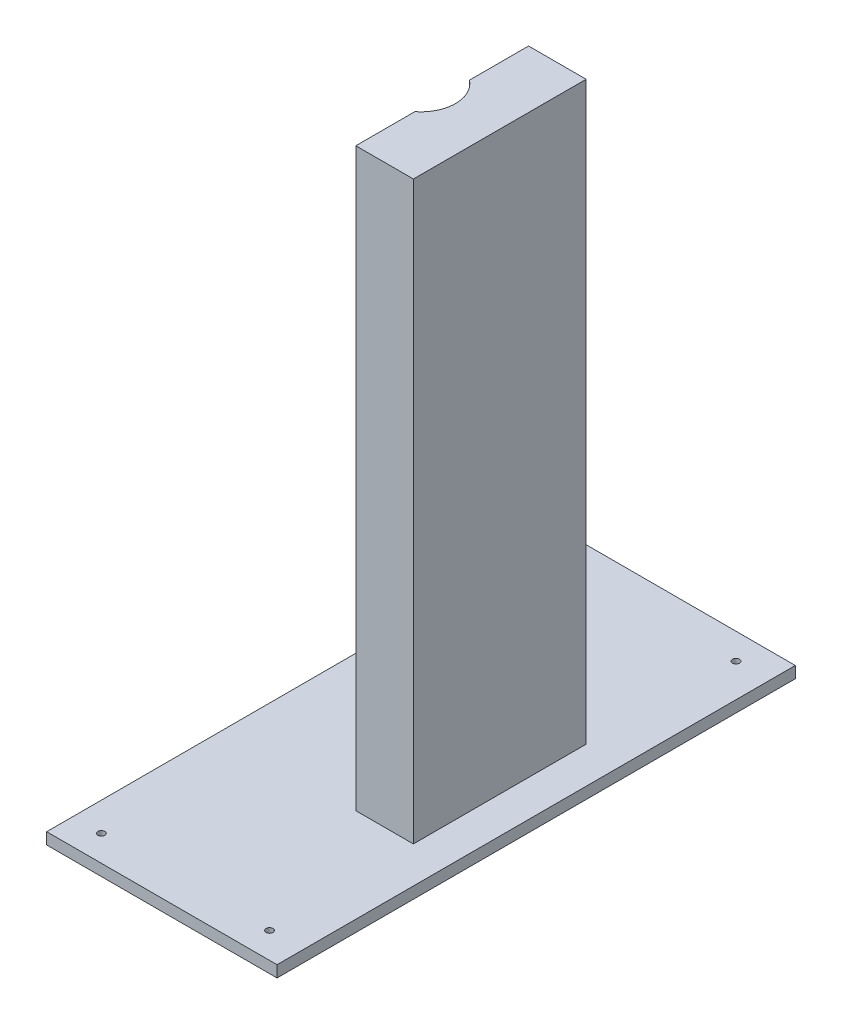
ISO-10303-21;
HEADER;
FILE_DESCRIPTION(('STEP AP214'),'2;1');
FILE_NAME('part.step','',(''),(''),'','','');
FILE_SCHEMA(('AUTOMOTIVE_DESIGN { 1 0 10303 214 1 1 1 1 }'));
ENDSEC;
DATA;
#1=APPLICATION_CONTEXT('core data for automotive mechanical design processes');
#2=APPLICATION_PROTOCOL_DEFINITION('international standard','automotive_design',2000,#1);
#3=PRODUCT_CONTEXT('',#1,'mechanical');
#4=PRODUCT('Part','Part','',(#3));
#5=PRODUCT_RELATED_PRODUCT_CATEGORY('part','',(#4));
#6=PRODUCT_DEFINITION_FORMATION('','',#4);
#7=PRODUCT_DEFINITION_CONTEXT('part definition',#1,'design');
#8=PRODUCT_DEFINITION('design','',#6,#7);
#9=PRODUCT_DEFINITION_SHAPE('','',#8);
#10=(LENGTH_UNIT() NAMED_UNIT(*) SI_UNIT(.MILLI.,.METRE.));
#11=(NAMED_UNIT(*) PLANE_ANGLE_UNIT() SI_UNIT($,.RADIAN.));
#12=(NAMED_UNIT(*) SI_UNIT($,.STERADIAN.) SOLID_ANGLE_UNIT());
#13=UNCERTAINTY_MEASURE_WITH_UNIT(LENGTH_MEASURE(1.E-05),#10,'distance_accuracy_value','');
#14=(GEOMETRIC_REPRESENTATION_CONTEXT(3) GLOBAL_UNCERTAINTY_ASSIGNED_CONTEXT((#13)) GLOBAL_UNIT_ASSIGNED_CONTEXT((#10,
#11,#12)) REPRESENTATION_CONTEXT('',''));
#15=CARTESIAN_POINT('',(0.,0.,0.));
#16=DIRECTION('',(0.,0.,1.));
#17=DIRECTION('',(1.,0.,0.));
#18=AXIS2_PLACEMENT_3D('',#15,#16,#17);
#19=CARTESIAN_POINT('',(0.,10.,0.));
#20=DIRECTION('',(0.,1.,0.));
#21=DIRECTION('',(0.,0.,1.));
#22=AXIS2_PLACEMENT_3D('',#19,#20,#21);
#23=PLANE('',#22);
#24=DIRECTION('',(0.,0.,-1.));
#25=VECTOR('',#24,1.);
#26=CARTESIAN_POINT('',(18.394275910826,10.,-1.21911485731604E-13));
#27=LINE('',#26,#25);
#28=CARTESIAN_POINT('',(18.3942759108265,10.,74.9999999999998));
#29=VERTEX_POINT('',#28);
#30=CARTESIAN_POINT('',(18.3942759108262,10.,23.6991690511798));
#31=VERTEX_POINT('',#30);
#32=EDGE_CURVE('E176',#29,#31,#27,.T.);
#33=ORIENTED_EDGE('',*,*,#32,.T.);
#34=CARTESIAN_POINT('',(0.,10.,0.));
#35=DIRECTION('',(0.,1.,0.));
#36=DIRECTION('',(0.,0.,1.));
#37=AXIS2_PLACEMENT_3D('',#34,#35,#36);
#38=CIRCLE('',#37,30.);
#39=CARTESIAN_POINT('',(18.3942759108259,10.,-23.6991690511801));
#40=VERTEX_POINT('',#39);
#41=EDGE_CURVE('E143',#40,#31,#38,.T.);
#42=ORIENTED_EDGE('',*,*,#41,.F.);
#43=DIRECTION('',(0.,0.,-1.));
#44=VECTOR('',#43,1.);
#45=CARTESIAN_POINT('',(18.394275910826,10.,-1.23155480483967E-13));
#46=LINE('',#45,#44);
#47=CARTESIAN_POINT('',(18.3942759108255,10.,-75.0000000000001));
#48=VERTEX_POINT('',#47);
#49=EDGE_CURVE('E155',#40,#48,#46,.T.);
#50=ORIENTED_EDGE('',*,*,#49,.T.);
#51=DIRECTION('',(-1.,0.,0.));
#52=VECTOR('',#51,1.);
#53=CARTESIAN_POINT('',(-4.99600361081321E-13,10.,-75.));
#54=LINE('',#53,#52);
#55=CARTESIAN_POINT('',(68.3942759108255,10.,-75.0000000000005));
#56=VERTEX_POINT('',#55);
#57=EDGE_CURVE('E188',#56,#48,#54,.T.);
#58=ORIENTED_EDGE('',*,*,#57,.F.);
#59=DIRECTION('',(0.,0.,1.));
#60=VECTOR('',#59,1.);
#61=CARTESIAN_POINT('',(68.394275910826,10.,-4.61925140868319E-13));
#62=LINE('',#61,#60);
#63=CARTESIAN_POINT('',(68.3942759108266,10.,74.9999999999995));
#64=VERTEX_POINT('',#63);
#65=EDGE_CURVE('E184',#56,#64,#62,.T.);
#66=ORIENTED_EDGE('',*,*,#65,.T.);
#67=DIRECTION('',(-1.,0.,0.));
#68=VECTOR('',#67,1.);
#69=CARTESIAN_POINT('',(4.57966997657877E-13,10.,75.));
#70=LINE('',#69,#68);
#71=EDGE_CURVE('E180',#64,#29,#70,.T.);
#72=ORIENTED_EDGE('',*,*,#71,.T.);
#73=EDGE_LOOP('',(#33,#42,#50,#58,#66,#72));
#74=FACE_BOUND('',#73,.T.);
#75=CARTESIAN_POINT('',(71.,10.,202.5));
#76=DIRECTION('',(0.,1.,0.));
#77=DIRECTION('',(0.,0.,-1.));
#78=AXIS2_PLACEMENT_3D('',#75,#76,#77);
#79=CIRCLE('',#78,3.00000000000001);
#80=CARTESIAN_POINT('',(71.,10.,199.5));
#81=VERTEX_POINT('',#80);
#82=EDGE_CURVE('E223',#81,#81,#79,.T.);
#83=ORIENTED_EDGE('',*,*,#82,.F.);
#84=EDGE_LOOP('',(#83));
#85=FACE_BOUND('',#84,.T.);
#86=CARTESIAN_POINT('',(-75.,10.,-202.5));
#87=DIRECTION('',(0.,1.,0.));
#88=DIRECTION('',(0.,0.,1.));
#89=AXIS2_PLACEMENT_3D('',#86,#87,#88);
#90=CIRCLE('',#89,3.00000000000001);
#91=CARTESIAN_POINT('',(-75.,10.,-199.5));
#92=VERTEX_POINT('',#91);
#93=EDGE_CURVE('E239',#92,#92,#90,.T.);
#94=ORIENTED_EDGE('',*,*,#93,.F.);
#95=EDGE_LOOP('',(#94));
#96=FACE_BOUND('',#95,.T.);
#97=DIRECTION('',(0.,0.,1.));
#98=VECTOR('',#97,1.);
#99=CARTESIAN_POINT('',(-100.,10.,225.));
#100=LINE('',#99,#98);
#101=CARTESIAN_POINT('',(-100.,10.,-225.));
#102=VERTEX_POINT('',#101);
#103=CARTESIAN_POINT('',(-100.,10.,225.));
#104=VERTEX_POINT('',#103);
#105=EDGE_CURVE('E247',#102,#104,#100,.T.);
#106=ORIENTED_EDGE('',*,*,#105,.T.);
#107=DIRECTION('',(1.,0.,0.));
#108=VECTOR('',#107,1.);
#109=CARTESIAN_POINT('',(99.9999999999999,10.,225.));
#110=LINE('',#109,#108);
#111=CARTESIAN_POINT('',(99.9999999999999,10.,225.));
#112=VERTEX_POINT('',#111);
#113=EDGE_CURVE('E94',#104,#112,#110,.T.);
#114=ORIENTED_EDGE('',*,*,#113,.T.);
#115=DIRECTION('',(0.,0.,-1.));
#116=VECTOR('',#115,1.);
#117=CARTESIAN_POINT('',(99.9999999999999,10.,225.));
#118=LINE('',#117,#116);
#119=CARTESIAN_POINT('',(99.9999999999999,10.,-225.));
#120=VERTEX_POINT('',#119);
#121=EDGE_CURVE('E252',#112,#120,#118,.T.);
#122=ORIENTED_EDGE('',*,*,#121,.T.);
#123=DIRECTION('',(-1.,0.,0.));
#124=VECTOR('',#123,1.);
#125=CARTESIAN_POINT('',(99.9999999999999,10.,-225.));
#126=LINE('',#125,#124);
#127=EDGE_CURVE('E66',#120,#102,#126,.T.);
#128=ORIENTED_EDGE('',*,*,#127,.T.);
#129=EDGE_LOOP('',(#106,#114,#122,#128));
#130=FACE_BOUND('',#129,.T.);
#131=CARTESIAN_POINT('',(71.,10.,-202.5));
#132=DIRECTION('',(0.,1.,0.));
#133=DIRECTION('',(0.,0.,1.));
#134=AXIS2_PLACEMENT_3D('',#131,#132,#133);
#135=CIRCLE('',#134,3.00000000000001);
#136=CARTESIAN_POINT('',(71.,10.,-199.5));
#137=VERTEX_POINT('',#136);
#138=EDGE_CURVE('E231',#137,#137,#135,.T.);
#139=ORIENTED_EDGE('',*,*,#138,.F.);
#140=EDGE_LOOP('',(#139));
#141=FACE_BOUND('',#140,.T.);
#142=CARTESIAN_POINT('',(-75.,10.,202.5));
#143=DIRECTION('',(0.,1.,0.));
#144=DIRECTION('',(0.,0.,-1.));
#145=AXIS2_PLACEMENT_3D('',#142,#143,#144);
#146=CIRCLE('',#145,3.00000000000001);
#147=CARTESIAN_POINT('',(-75.,10.,199.5));
#148=VERTEX_POINT('',#147);
#149=EDGE_CURVE('E215',#148,#148,#146,.T.);
#150=ORIENTED_EDGE('',*,*,#149,.F.);
#151=EDGE_LOOP('',(#150));
#152=FACE_BOUND('',#151,.T.);
#153=ADVANCED_FACE('F41',(#74,#85,#96,#130,#141,#152),#23,.T.);
#154=CARTESIAN_POINT('',(0.,0.,0.));
#155=DIRECTION('',(0.,1.,0.));
#156=DIRECTION('',(0.,0.,1.));
#157=AXIS2_PLACEMENT_3D('',#154,#155,#156);
#158=PLANE('',#157);
#159=DIRECTION('',(0.,0.,1.));
#160=VECTOR('',#159,1.);
#161=CARTESIAN_POINT('',(-100.,0.,225.));
#162=LINE('',#161,#160);
#163=CARTESIAN_POINT('',(-100.,0.,-225.));
#164=VERTEX_POINT('',#163);
#165=CARTESIAN_POINT('',(-100.,0.,225.));
#166=VERTEX_POINT('',#165);
#167=EDGE_CURVE('E243',#164,#166,#162,.T.);
#168=ORIENTED_EDGE('',*,*,#167,.F.);
#169=DIRECTION('',(-1.,0.,0.));
#170=VECTOR('',#169,1.);
#171=CARTESIAN_POINT('',(99.9999999999999,0.,-225.));
#172=LINE('',#171,#170);
#173=CARTESIAN_POINT('',(99.9999999999999,0.,-225.));
#174=VERTEX_POINT('',#173);
#175=EDGE_CURVE('E87',#174,#164,#172,.T.);
#176=ORIENTED_EDGE('',*,*,#175,.F.);
#177=DIRECTION('',(0.,0.,-1.));
#178=VECTOR('',#177,1.);
#179=CARTESIAN_POINT('',(99.9999999999999,0.,225.));
#180=LINE('',#179,#178);
#181=CARTESIAN_POINT('',(99.9999999999999,0.,225.));
#182=VERTEX_POINT('',#181);
#183=EDGE_CURVE('E264',#182,#174,#180,.T.);
#184=ORIENTED_EDGE('',*,*,#183,.F.);
#185=DIRECTION('',(1.,0.,0.));
#186=VECTOR('',#185,1.);
#187=CARTESIAN_POINT('',(99.9999999999999,0.,225.));
#188=LINE('',#187,#186);
#189=EDGE_CURVE('E261',#166,#182,#188,.T.);
#190=ORIENTED_EDGE('',*,*,#189,.F.);
#191=EDGE_LOOP('',(#168,#176,#184,#190));
#192=FACE_BOUND('',#191,.T.);
#193=CARTESIAN_POINT('',(-75.,0.,-202.5));
#194=DIRECTION('',(0.,1.,0.));
#195=DIRECTION('',(0.,0.,1.));
#196=AXIS2_PLACEMENT_3D('',#193,#194,#195);
#197=CIRCLE('',#196,3.00000000000001);
#198=CARTESIAN_POINT('',(-75.,0.,-199.5));
#199=VERTEX_POINT('',#198);
#200=EDGE_CURVE('E235',#199,#199,#197,.T.);
#201=ORIENTED_EDGE('',*,*,#200,.T.);
#202=EDGE_LOOP('',(#201));
#203=FACE_BOUND('',#202,.T.);
#204=CARTESIAN_POINT('',(71.,0.,-202.5));
#205=DIRECTION('',(0.,1.,0.));
#206=DIRECTION('',(0.,0.,1.));
#207=AXIS2_PLACEMENT_3D('',#204,#205,#206);
#208=CIRCLE('',#207,3.00000000000001);
#209=CARTESIAN_POINT('',(71.,0.,-199.5));
#210=VERTEX_POINT('',#209);
#211=EDGE_CURVE('E227',#210,#210,#208,.T.);
#212=ORIENTED_EDGE('',*,*,#211,.T.);
#213=EDGE_LOOP('',(#212));
#214=FACE_BOUND('',#213,.T.);
#215=CARTESIAN_POINT('',(71.,0.,202.5));
#216=DIRECTION('',(0.,1.,0.));
#217=DIRECTION('',(0.,0.,-1.));
#218=AXIS2_PLACEMENT_3D('',#215,#216,#217);
#219=CIRCLE('',#218,3.00000000000001);
#220=CARTESIAN_POINT('',(71.,0.,199.5));
#221=VERTEX_POINT('',#220);
#222=EDGE_CURVE('E219',#221,#221,#219,.T.);
#223=ORIENTED_EDGE('',*,*,#222,.T.);
#224=EDGE_LOOP('',(#223));
#225=FACE_BOUND('',#224,.T.);
#226=CARTESIAN_POINT('',(-75.,0.,202.5));
#227=DIRECTION('',(0.,1.,0.));
#228=DIRECTION('',(0.,0.,-1.));
#229=AXIS2_PLACEMENT_3D('',#226,#227,#228);
#230=CIRCLE('',#229,3.00000000000001);
#231=CARTESIAN_POINT('',(-75.,0.,199.5));
#232=VERTEX_POINT('',#231);
#233=EDGE_CURVE('E210',#232,#232,#230,.T.);
#234=ORIENTED_EDGE('',*,*,#233,.T.);
#235=EDGE_LOOP('',(#234));
#236=FACE_BOUND('',#235,.T.);
#237=ADVANCED_FACE('F282',(#192,#203,#214,#225,#236),#158,.F.);
#238=CARTESIAN_POINT('',(-100.,10.,225.));
#239=DIRECTION('',(1.,0.,0.));
#240=DIRECTION('',(0.,0.,-1.));
#241=AXIS2_PLACEMENT_3D('',#238,#239,#240);
#242=PLANE('',#241);
#243=ORIENTED_EDGE('',*,*,#167,.T.);
#244=DIRECTION('',(0.,-1.,0.));
#245=VECTOR('',#244,1.);
#246=CARTESIAN_POINT('',(-100.,10.,225.));
#247=LINE('',#246,#245);
#248=EDGE_CURVE('E11',#104,#166,#247,.T.);
#249=ORIENTED_EDGE('',*,*,#248,.F.);
#250=ORIENTED_EDGE('',*,*,#105,.F.);
#251=DIRECTION('',(0.,-1.,0.));
#252=VECTOR('',#251,1.);
#253=CARTESIAN_POINT('',(-100.,10.,-225.));
#254=LINE('',#253,#252);
#255=EDGE_CURVE('E257',#102,#164,#254,.T.);
#256=ORIENTED_EDGE('',*,*,#255,.T.);
#257=EDGE_LOOP('',(#243,#249,#250,#256));
#258=FACE_BOUND('',#257,.T.);
#259=ADVANCED_FACE('F43',(#258),#242,.F.);
#260=CARTESIAN_POINT('',(99.9999999999999,10.,225.));
#261=DIRECTION('',(0.,0.,-1.));
#262=DIRECTION('',(-1.,0.,0.));
#263=AXIS2_PLACEMENT_3D('',#260,#261,#262);
#264=PLANE('',#263);
#265=ORIENTED_EDGE('',*,*,#189,.T.);
#266=DIRECTION('',(0.,-1.,0.));
#267=VECTOR('',#266,1.);
#268=CARTESIAN_POINT('',(99.9999999999999,10.,225.));
#269=LINE('',#268,#267);
#270=EDGE_CURVE('E50',#112,#182,#269,.T.);
#271=ORIENTED_EDGE('',*,*,#270,.F.);
#272=ORIENTED_EDGE('',*,*,#113,.F.);
#273=ORIENTED_EDGE('',*,*,#248,.T.);
#274=EDGE_LOOP('',(#265,#271,#272,#273));
#275=FACE_BOUND('',#274,.T.);
#276=ADVANCED_FACE('F298',(#275),#264,.F.);
#277=CARTESIAN_POINT('',(99.9999999999999,10.,225.));
#278=DIRECTION('',(-1.,0.,0.));
#279=DIRECTION('',(0.,0.,1.));
#280=AXIS2_PLACEMENT_3D('',#277,#278,#279);
#281=PLANE('',#280);
#282=ORIENTED_EDGE('',*,*,#183,.T.);
#283=DIRECTION('',(0.,-1.,0.));
#284=VECTOR('',#283,1.);
#285=CARTESIAN_POINT('',(99.9999999999999,10.,-225.));
#286=LINE('',#285,#284);
#287=EDGE_CURVE('E271',#120,#174,#286,.T.);
#288=ORIENTED_EDGE('',*,*,#287,.F.);
#289=ORIENTED_EDGE('',*,*,#121,.F.);
#290=ORIENTED_EDGE('',*,*,#270,.T.);
#291=EDGE_LOOP('',(#282,#288,#289,#290));
#292=FACE_BOUND('',#291,.T.);
#293=ADVANCED_FACE('F278',(#292),#281,.F.);
#294=CARTESIAN_POINT('',(99.9999999999999,10.,-225.));
#295=DIRECTION('',(0.,0.,1.));
#296=DIRECTION('',(1.,0.,0.));
#297=AXIS2_PLACEMENT_3D('',#294,#295,#296);
#298=PLANE('',#297);
#299=ORIENTED_EDGE('',*,*,#175,.T.);
#300=ORIENTED_EDGE('',*,*,#255,.F.);
#301=ORIENTED_EDGE('',*,*,#127,.F.);
#302=ORIENTED_EDGE('',*,*,#287,.T.);
#303=EDGE_LOOP('',(#299,#300,#301,#302));
#304=FACE_BOUND('',#303,.T.);
#305=ADVANCED_FACE('F287',(#304),#298,.F.);
#306=CARTESIAN_POINT('',(-75.,10.,-202.5));
#307=DIRECTION('',(0.,-1.,0.));
#308=DIRECTION('',(0.,0.,-1.));
#309=AXIS2_PLACEMENT_3D('',#306,#307,#308);
#310=CYLINDRICAL_SURFACE('',#309,3.00000000000001);
#311=ORIENTED_EDGE('',*,*,#93,.T.);
#312=EDGE_LOOP('',(#311));
#313=FACE_BOUND('',#312,.T.);
#314=ORIENTED_EDGE('',*,*,#200,.F.);
#315=EDGE_LOOP('',(#314));
#316=FACE_BOUND('',#315,.T.);
#317=ADVANCED_FACE('F289',(#313,#316),#310,.F.);
#318=CARTESIAN_POINT('',(71.,10.,-202.5));
#319=DIRECTION('',(0.,-1.,0.));
#320=DIRECTION('',(0.,0.,-1.));
#321=AXIS2_PLACEMENT_3D('',#318,#319,#320);
#322=CYLINDRICAL_SURFACE('',#321,3.00000000000001);
#323=ORIENTED_EDGE('',*,*,#138,.T.);
#324=EDGE_LOOP('',(#323));
#325=FACE_BOUND('',#324,.T.);
#326=ORIENTED_EDGE('',*,*,#211,.F.);
#327=EDGE_LOOP('',(#326));
#328=FACE_BOUND('',#327,.T.);
#329=ADVANCED_FACE('F295',(#325,#328),#322,.F.);
#330=CARTESIAN_POINT('',(71.,10.,202.5));
#331=DIRECTION('',(0.,-1.,0.));
#332=DIRECTION('',(0.,0.,-1.));
#333=AXIS2_PLACEMENT_3D('',#330,#331,#332);
#334=CYLINDRICAL_SURFACE('',#333,3.00000000000001);
#335=ORIENTED_EDGE('',*,*,#82,.T.);
#336=EDGE_LOOP('',(#335));
#337=FACE_BOUND('',#336,.T.);
#338=ORIENTED_EDGE('',*,*,#222,.F.);
#339=EDGE_LOOP('',(#338));
#340=FACE_BOUND('',#339,.T.);
#341=ADVANCED_FACE('F313',(#337,#340),#334,.F.);
#342=CARTESIAN_POINT('',(-75.,10.,202.5));
#343=DIRECTION('',(0.,-1.,0.));
#344=DIRECTION('',(0.,0.,-1.));
#345=AXIS2_PLACEMENT_3D('',#342,#343,#344);
#346=CYLINDRICAL_SURFACE('',#345,3.00000000000001);
#347=ORIENTED_EDGE('',*,*,#149,.T.);
#348=EDGE_LOOP('',(#347));
#349=FACE_BOUND('',#348,.T.);
#350=ORIENTED_EDGE('',*,*,#233,.F.);
#351=EDGE_LOOP('',(#350));
#352=FACE_BOUND('',#351,.T.);
#353=ADVANCED_FACE('F317',(#349,#352),#346,.F.);
#354=CARTESIAN_POINT('',(0.,310.,0.));
#355=DIRECTION('',(0.,-1.,0.));
#356=DIRECTION('',(0.,0.,-1.));
#357=AXIS2_PLACEMENT_3D('',#354,#355,#356);
#358=CYLINDRICAL_SURFACE('',#357,30.);
#359=ORIENTED_EDGE('',*,*,#41,.T.);
#360=DIRECTION('',(0.,-1.,0.));
#361=VECTOR('',#360,1.);
#362=CARTESIAN_POINT('',(18.3942759108262,510.,23.6991690511798));
#363=LINE('',#362,#361);
#364=CARTESIAN_POINT('',(18.3942759108262,310.,23.6991690511798));
#365=VERTEX_POINT('',#364);
#366=EDGE_CURVE('E144',#365,#31,#363,.T.);
#367=ORIENTED_EDGE('',*,*,#366,.F.);
#368=CARTESIAN_POINT('',(0.,310.,0.));
#369=DIRECTION('',(0.,1.,0.));
#370=DIRECTION('',(0.,0.,1.));
#371=AXIS2_PLACEMENT_3D('',#368,#369,#370);
#372=CIRCLE('',#371,30.);
#373=CARTESIAN_POINT('',(18.3942759108259,310.,-23.6991690511801));
#374=VERTEX_POINT('',#373);
#375=EDGE_CURVE('E211',#374,#365,#372,.T.);
#376=ORIENTED_EDGE('',*,*,#375,.F.);
#377=DIRECTION('',(0.,-1.,0.));
#378=VECTOR('',#377,1.);
#379=CARTESIAN_POINT('',(18.3942759108259,510.,-23.6991690511801));
#380=LINE('',#379,#378);
#381=EDGE_CURVE('E175',#374,#40,#380,.T.);
#382=ORIENTED_EDGE('',*,*,#381,.T.);
#383=EDGE_LOOP('',(#359,#367,#376,#382));
#384=FACE_BOUND('',#383,.T.);
#385=ADVANCED_FACE('F321',(#384),#358,.T.);
#386=CARTESIAN_POINT('',(0.,310.,0.));
#387=DIRECTION('',(0.,1.,0.));
#388=DIRECTION('',(0.,0.,1.));
#389=AXIS2_PLACEMENT_3D('',#386,#387,#388);
#390=PLANE('',#389);
#391=EDGE_CURVE('E138',#365,#374,#372,.T.);
#392=ORIENTED_EDGE('',*,*,#391,.T.);
#393=ORIENTED_EDGE('',*,*,#375,.T.);
#394=EDGE_LOOP('',(#392,#393));
#395=FACE_BOUND('',#394,.T.);
#396=ADVANCED_FACE('F325',(#395),#390,.T.);
#397=CARTESIAN_POINT('',(0.,510.,0.));
#398=DIRECTION('',(0.,-1.,0.));
#399=DIRECTION('',(0.,0.,-1.));
#400=AXIS2_PLACEMENT_3D('',#397,#398,#399);
#401=CYLINDRICAL_SURFACE('',#400,30.);
#402=CARTESIAN_POINT('',(18.3942759108259,510.,-23.6991690511801));
#403=VERTEX_POINT('',#402);
#404=EDGE_CURVE('E57',#403,#374,#380,.T.);
#405=ORIENTED_EDGE('',*,*,#404,.T.);
#406=ORIENTED_EDGE('',*,*,#391,.F.);
#407=CARTESIAN_POINT('',(18.3942759108262,510.,23.6991690511798));
#408=VERTEX_POINT('',#407);
#409=EDGE_CURVE('E132',#408,#365,#363,.T.);
#410=ORIENTED_EDGE('',*,*,#409,.F.);
#411=CARTESIAN_POINT('',(0.,510.,0.));
#412=DIRECTION('',(0.,1.,0.));
#413=DIRECTION('',(0.,0.,1.));
#414=AXIS2_PLACEMENT_3D('',#411,#412,#413);
#415=CIRCLE('',#414,30.);
#416=EDGE_CURVE('E135',#408,#403,#415,.T.);
#417=ORIENTED_EDGE('',*,*,#416,.T.);
#418=EDGE_LOOP('',(#405,#406,#410,#417));
#419=FACE_BOUND('',#418,.T.);
#420=ADVANCED_FACE('F134',(#419),#401,.F.);
#421=CARTESIAN_POINT('',(18.394275910826,510.,-1.21911485731604E-13));
#422=DIRECTION('',(-1.,0.,0.));
#423=DIRECTION('',(0.,0.,1.));
#424=AXIS2_PLACEMENT_3D('',#421,#422,#423);
#425=PLANE('',#424);
#426=ORIENTED_EDGE('',*,*,#32,.F.);
#427=DIRECTION('',(0.,-1.,0.));
#428=VECTOR('',#427,1.);
#429=CARTESIAN_POINT('',(18.3942759108265,510.,74.9999999999998));
#430=LINE('',#429,#428);
#431=CARTESIAN_POINT('',(18.3942759108265,510.,74.9999999999998));
#432=VERTEX_POINT('',#431);
#433=EDGE_CURVE('E159',#432,#29,#430,.T.);
#434=ORIENTED_EDGE('',*,*,#433,.F.);
#435=DIRECTION('',(0.,0.,-1.));
#436=VECTOR('',#435,1.);
#437=CARTESIAN_POINT('',(18.394275910826,510.,-1.21911485731604E-13));
#438=LINE('',#437,#436);
#439=EDGE_CURVE('E150',#432,#408,#438,.T.);
#440=ORIENTED_EDGE('',*,*,#439,.T.);
#441=ORIENTED_EDGE('',*,*,#409,.T.);
#442=ORIENTED_EDGE('',*,*,#366,.T.);
#443=EDGE_LOOP('',(#426,#434,#440,#441,#442));
#444=FACE_BOUND('',#443,.T.);
#445=ADVANCED_FACE('F158',(#444),#425,.T.);
#446=CARTESIAN_POINT('',(4.57966997657877E-13,510.,75.));
#447=DIRECTION('',(0.,0.,1.));
#448=DIRECTION('',(1.,0.,0.));
#449=AXIS2_PLACEMENT_3D('',#446,#447,#448);
#450=PLANE('',#449);
#451=ORIENTED_EDGE('',*,*,#71,.F.);
#452=DIRECTION('',(0.,-1.,0.));
#453=VECTOR('',#452,1.);
#454=CARTESIAN_POINT('',(68.3942759108266,510.,74.9999999999995));
#455=LINE('',#454,#453);
#456=CARTESIAN_POINT('',(68.3942759108266,510.,74.9999999999995));
#457=VERTEX_POINT('',#456);
#458=EDGE_CURVE('E203',#457,#64,#455,.T.);
#459=ORIENTED_EDGE('',*,*,#458,.F.);
#460=DIRECTION('',(-1.,0.,0.));
#461=VECTOR('',#460,1.);
#462=CARTESIAN_POINT('',(4.57966997657877E-13,510.,75.));
#463=LINE('',#462,#461);
#464=EDGE_CURVE('E161',#457,#432,#463,.T.);
#465=ORIENTED_EDGE('',*,*,#464,.T.);
#466=ORIENTED_EDGE('',*,*,#433,.T.);
#467=EDGE_LOOP('',(#451,#459,#465,#466));
#468=FACE_BOUND('',#467,.T.);
#469=ADVANCED_FACE('F334',(#468),#450,.T.);
#470=CARTESIAN_POINT('',(68.394275910826,510.,-4.61925140868319E-13));
#471=DIRECTION('',(1.,0.,0.));
#472=DIRECTION('',(0.,0.,-1.));
#473=AXIS2_PLACEMENT_3D('',#470,#471,#472);
#474=PLANE('',#473);
#475=ORIENTED_EDGE('',*,*,#65,.F.);
#476=DIRECTION('',(0.,-1.,0.));
#477=VECTOR('',#476,1.);
#478=CARTESIAN_POINT('',(68.3942759108255,510.,-75.0000000000005));
#479=LINE('',#478,#477);
#480=CARTESIAN_POINT('',(68.3942759108255,510.,-75.0000000000005));
#481=VERTEX_POINT('',#480);
#482=EDGE_CURVE('E200',#481,#56,#479,.T.);
#483=ORIENTED_EDGE('',*,*,#482,.F.);
#484=DIRECTION('',(0.,0.,1.));
#485=VECTOR('',#484,1.);
#486=CARTESIAN_POINT('',(68.394275910826,510.,-4.61925140868319E-13));
#487=LINE('',#486,#485);
#488=EDGE_CURVE('E164',#481,#457,#487,.T.);
#489=ORIENTED_EDGE('',*,*,#488,.T.);
#490=ORIENTED_EDGE('',*,*,#458,.T.);
#491=EDGE_LOOP('',(#475,#483,#489,#490));
#492=FACE_BOUND('',#491,.T.);
#493=ADVANCED_FACE('F337',(#492),#474,.T.);
#494=CARTESIAN_POINT('',(-4.99600361081321E-13,510.,-75.));
#495=DIRECTION('',(0.,0.,1.));
#496=DIRECTION('',(1.,0.,0.));
#497=AXIS2_PLACEMENT_3D('',#494,#495,#496);
#498=PLANE('',#497);
#499=ORIENTED_EDGE('',*,*,#57,.T.);
#500=DIRECTION('',(0.,-1.,0.));
#501=VECTOR('',#500,1.);
#502=CARTESIAN_POINT('',(18.3942759108255,510.,-75.0000000000001));
#503=LINE('',#502,#501);
#504=CARTESIAN_POINT('',(18.3942759108255,510.,-75.0000000000001));
#505=VERTEX_POINT('',#504);
#506=EDGE_CURVE('E197',#505,#48,#503,.T.);
#507=ORIENTED_EDGE('',*,*,#506,.F.);
#508=DIRECTION('',(-1.,0.,0.));
#509=VECTOR('',#508,1.);
#510=CARTESIAN_POINT('',(-4.99600361081321E-13,510.,-75.));
#511=LINE('',#510,#509);
#512=EDGE_CURVE('E170',#481,#505,#511,.T.);
#513=ORIENTED_EDGE('',*,*,#512,.F.);
#514=ORIENTED_EDGE('',*,*,#482,.T.);
#515=EDGE_LOOP('',(#499,#507,#513,#514));
#516=FACE_BOUND('',#515,.T.);
#517=ADVANCED_FACE('F341',(#516),#498,.F.);
#518=CARTESIAN_POINT('',(18.394275910826,510.,-1.23155480483967E-13));
#519=DIRECTION('',(-1.,0.,0.));
#520=DIRECTION('',(0.,0.,1.));
#521=AXIS2_PLACEMENT_3D('',#518,#519,#520);
#522=PLANE('',#521);
#523=ORIENTED_EDGE('',*,*,#49,.F.);
#524=ORIENTED_EDGE('',*,*,#381,.F.);
#525=ORIENTED_EDGE('',*,*,#404,.F.);
#526=DIRECTION('',(0.,0.,-1.));
#527=VECTOR('',#526,1.);
#528=CARTESIAN_POINT('',(18.394275910826,510.,-1.23155480483967E-13));
#529=LINE('',#528,#527);
#530=EDGE_CURVE('E153',#403,#505,#529,.T.);
#531=ORIENTED_EDGE('',*,*,#530,.T.);
#532=ORIENTED_EDGE('',*,*,#506,.T.);
#533=EDGE_LOOP('',(#523,#524,#525,#531,#532));
#534=FACE_BOUND('',#533,.T.);
#535=ADVANCED_FACE('F345',(#534),#522,.T.);
#536=CARTESIAN_POINT('',(0.,510.,0.));
#537=DIRECTION('',(0.,1.,0.));
#538=DIRECTION('',(0.,0.,1.));
#539=AXIS2_PLACEMENT_3D('',#536,#537,#538);
#540=PLANE('',#539);
#541=ORIENTED_EDGE('',*,*,#416,.F.);
#542=ORIENTED_EDGE('',*,*,#439,.F.);
#543=ORIENTED_EDGE('',*,*,#464,.F.);
#544=ORIENTED_EDGE('',*,*,#488,.F.);
#545=ORIENTED_EDGE('',*,*,#512,.T.);
#546=ORIENTED_EDGE('',*,*,#530,.F.);
#547=EDGE_LOOP('',(#541,#542,#543,#544,#545,#546));
#548=FACE_BOUND('',#547,.T.);
#549=ADVANCED_FACE('F148',(#548),#540,.T.);
#550=CLOSED_SHELL('',(#153,#237,#259,#276,#293,#305,#317,#329,#341,#353,#385,#396,#420,#445,
#469,#493,#517,#535,#549));
#551=MANIFOLD_SOLID_BREP('B2',#550);
#552=ADVANCED_BREP_SHAPE_REPRESENTATION('',(#18,#551),#14);
#553=SHAPE_DEFINITION_REPRESENTATION(#9,#552);
ENDSEC;
END-ISO-10303-21;
